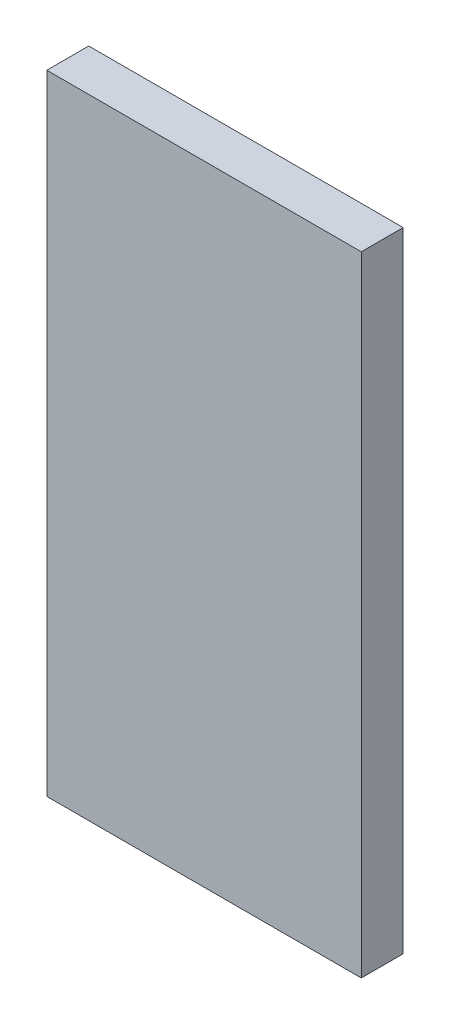
ISO-10303-21;
HEADER;
FILE_DESCRIPTION(('STEP AP214'),'2;1');
FILE_NAME('part.step','',(''),(''),'','','');
FILE_SCHEMA(('AUTOMOTIVE_DESIGN { 1 0 10303 214 1 1 1 1 }'));
ENDSEC;
DATA;
#1=APPLICATION_CONTEXT('core data for automotive mechanical design processes');
#2=APPLICATION_PROTOCOL_DEFINITION('international standard','automotive_design',2000,#1);
#3=PRODUCT_CONTEXT('',#1,'mechanical');
#4=PRODUCT('Part','Part','',(#3));
#5=PRODUCT_RELATED_PRODUCT_CATEGORY('part','',(#4));
#6=PRODUCT_DEFINITION_FORMATION('','',#4);
#7=PRODUCT_DEFINITION_CONTEXT('part definition',#1,'design');
#8=PRODUCT_DEFINITION('design','',#6,#7);
#9=PRODUCT_DEFINITION_SHAPE('','',#8);
#10=(LENGTH_UNIT() NAMED_UNIT(*) SI_UNIT(.MILLI.,.METRE.));
#11=(NAMED_UNIT(*) PLANE_ANGLE_UNIT() SI_UNIT($,.RADIAN.));
#12=(NAMED_UNIT(*) SI_UNIT($,.STERADIAN.) SOLID_ANGLE_UNIT());
#13=UNCERTAINTY_MEASURE_WITH_UNIT(LENGTH_MEASURE(1.E-05),#10,'distance_accuracy_value','');
#14=(GEOMETRIC_REPRESENTATION_CONTEXT(3) GLOBAL_UNCERTAINTY_ASSIGNED_CONTEXT((#13)) GLOBAL_UNIT_ASSIGNED_CONTEXT((#10,
#11,#12)) REPRESENTATION_CONTEXT('',''));
#15=CARTESIAN_POINT('',(0.,0.,0.));
#16=DIRECTION('',(0.,0.,1.));
#17=DIRECTION('',(1.,0.,0.));
#18=AXIS2_PLACEMENT_3D('',#15,#16,#17);
#19=CARTESIAN_POINT('',(-7.5,-15.,2.));
#20=DIRECTION('',(1.,0.,0.));
#21=DIRECTION('',(0.,1.,0.));
#22=AXIS2_PLACEMENT_3D('',#19,#20,#21);
#23=PLANE('',#22);
#24=DIRECTION('',(0.,-1.,0.));
#25=VECTOR('',#24,1.);
#26=CARTESIAN_POINT('',(-7.5,-15.,0.));
#27=LINE('',#26,#25);
#28=CARTESIAN_POINT('',(-7.5,15.,0.));
#29=VERTEX_POINT('',#28);
#30=CARTESIAN_POINT('',(-7.5,-15.,0.));
#31=VERTEX_POINT('',#30);
#32=EDGE_CURVE('E96',#29,#31,#27,.T.);
#33=ORIENTED_EDGE('',*,*,#32,.T.);
#34=DIRECTION('',(0.,0.,-1.));
#35=VECTOR('',#34,1.);
#36=CARTESIAN_POINT('',(-7.5,-15.,2.));
#37=LINE('',#36,#35);
#38=CARTESIAN_POINT('',(-7.5,-15.,2.));
#39=VERTEX_POINT('',#38);
#40=EDGE_CURVE('E11',#39,#31,#37,.T.);
#41=ORIENTED_EDGE('',*,*,#40,.F.);
#42=DIRECTION('',(0.,-1.,0.));
#43=VECTOR('',#42,1.);
#44=CARTESIAN_POINT('',(-7.5,-15.,2.));
#45=LINE('',#44,#43);
#46=CARTESIAN_POINT('',(-7.5,15.,2.));
#47=VERTEX_POINT('',#46);
#48=EDGE_CURVE('E84',#47,#39,#45,.T.);
#49=ORIENTED_EDGE('',*,*,#48,.F.);
#50=DIRECTION('',(0.,0.,-1.));
#51=VECTOR('',#50,1.);
#52=CARTESIAN_POINT('',(-7.5,15.,2.));
#53=LINE('',#52,#51);
#54=EDGE_CURVE('E92',#47,#29,#53,.T.);
#55=ORIENTED_EDGE('',*,*,#54,.T.);
#56=EDGE_LOOP('',(#33,#41,#49,#55));
#57=FACE_BOUND('',#56,.T.);
#58=ADVANCED_FACE('F33',(#57),#23,.F.);
#59=CARTESIAN_POINT('',(7.5,-15.,2.));
#60=DIRECTION('',(0.,1.,0.));
#61=DIRECTION('',(-1.,0.,0.));
#62=AXIS2_PLACEMENT_3D('',#59,#60,#61);
#63=PLANE('',#62);
#64=DIRECTION('',(1.,0.,0.));
#65=VECTOR('',#64,1.);
#66=CARTESIAN_POINT('',(7.5,-15.,0.));
#67=LINE('',#66,#65);
#68=CARTESIAN_POINT('',(7.5,-15.,0.));
#69=VERTEX_POINT('',#68);
#70=EDGE_CURVE('E88',#31,#69,#67,.T.);
#71=ORIENTED_EDGE('',*,*,#70,.T.);
#72=DIRECTION('',(0.,0.,-1.));
#73=VECTOR('',#72,1.);
#74=CARTESIAN_POINT('',(7.5,-15.,2.));
#75=LINE('',#74,#73);
#76=CARTESIAN_POINT('',(7.5,-15.,2.));
#77=VERTEX_POINT('',#76);
#78=EDGE_CURVE('E41',#77,#69,#75,.T.);
#79=ORIENTED_EDGE('',*,*,#78,.F.);
#80=DIRECTION('',(1.,0.,0.));
#81=VECTOR('',#80,1.);
#82=CARTESIAN_POINT('',(7.5,-15.,2.));
#83=LINE('',#82,#81);
#84=EDGE_CURVE('E79',#39,#77,#83,.T.);
#85=ORIENTED_EDGE('',*,*,#84,.F.);
#86=ORIENTED_EDGE('',*,*,#40,.T.);
#87=EDGE_LOOP('',(#71,#79,#85,#86));
#88=FACE_BOUND('',#87,.T.);
#89=ADVANCED_FACE('F87',(#88),#63,.F.);
#90=CARTESIAN_POINT('',(7.5,-15.,2.));
#91=DIRECTION('',(-1.,0.,0.));
#92=DIRECTION('',(0.,0.,1.));
#93=AXIS2_PLACEMENT_3D('',#90,#91,#92);
#94=PLANE('',#93);
#95=DIRECTION('',(0.,1.,0.));
#96=VECTOR('',#95,1.);
#97=CARTESIAN_POINT('',(7.5,-15.,0.));
#98=LINE('',#97,#96);
#99=CARTESIAN_POINT('',(7.5,15.,0.));
#100=VERTEX_POINT('',#99);
#101=EDGE_CURVE('E66',#69,#100,#98,.T.);
#102=ORIENTED_EDGE('',*,*,#101,.T.);
#103=DIRECTION('',(0.,0.,-1.));
#104=VECTOR('',#103,1.);
#105=CARTESIAN_POINT('',(7.5,15.,2.));
#106=LINE('',#105,#104);
#107=CARTESIAN_POINT('',(7.5,15.,2.));
#108=VERTEX_POINT('',#107);
#109=EDGE_CURVE('E89',#108,#100,#106,.T.);
#110=ORIENTED_EDGE('',*,*,#109,.F.);
#111=DIRECTION('',(0.,1.,0.));
#112=VECTOR('',#111,1.);
#113=CARTESIAN_POINT('',(7.5,-15.,2.));
#114=LINE('',#113,#112);
#115=EDGE_CURVE('E82',#77,#108,#114,.T.);
#116=ORIENTED_EDGE('',*,*,#115,.F.);
#117=ORIENTED_EDGE('',*,*,#78,.T.);
#118=EDGE_LOOP('',(#102,#110,#116,#117));
#119=FACE_BOUND('',#118,.T.);
#120=ADVANCED_FACE('F90',(#119),#94,.F.);
#121=CARTESIAN_POINT('',(7.5,15.,2.));
#122=DIRECTION('',(0.,-1.,0.));
#123=DIRECTION('',(0.,0.,-1.));
#124=AXIS2_PLACEMENT_3D('',#121,#122,#123);
#125=PLANE('',#124);
#126=DIRECTION('',(-1.,0.,0.));
#127=VECTOR('',#126,1.);
#128=CARTESIAN_POINT('',(7.5,15.,0.));
#129=LINE('',#128,#127);
#130=EDGE_CURVE('E72',#100,#29,#129,.T.);
#131=ORIENTED_EDGE('',*,*,#130,.T.);
#132=ORIENTED_EDGE('',*,*,#54,.F.);
#133=DIRECTION('',(-1.,0.,0.));
#134=VECTOR('',#133,1.);
#135=CARTESIAN_POINT('',(7.5,15.,2.));
#136=LINE('',#135,#134);
#137=EDGE_CURVE('E49',#108,#47,#136,.T.);
#138=ORIENTED_EDGE('',*,*,#137,.F.);
#139=ORIENTED_EDGE('',*,*,#109,.T.);
#140=EDGE_LOOP('',(#131,#132,#138,#139));
#141=FACE_BOUND('',#140,.T.);
#142=ADVANCED_FACE('F103',(#141),#125,.F.);
#143=CARTESIAN_POINT('',(0.,0.,2.));
#144=DIRECTION('',(0.,0.,1.));
#145=DIRECTION('',(1.,0.,0.));
#146=AXIS2_PLACEMENT_3D('',#143,#144,#145);
#147=PLANE('',#146);
#148=ORIENTED_EDGE('',*,*,#48,.T.);
#149=ORIENTED_EDGE('',*,*,#84,.T.);
#150=ORIENTED_EDGE('',*,*,#115,.T.);
#151=ORIENTED_EDGE('',*,*,#137,.T.);
#152=EDGE_LOOP('',(#148,#149,#150,#151));
#153=FACE_BOUND('',#152,.T.);
#154=ADVANCED_FACE('F80',(#153),#147,.T.);
#155=CARTESIAN_POINT('',(0.,0.,0.));
#156=DIRECTION('',(0.,0.,1.));
#157=DIRECTION('',(1.,0.,0.));
#158=AXIS2_PLACEMENT_3D('',#155,#156,#157);
#159=PLANE('',#158);
#160=ORIENTED_EDGE('',*,*,#32,.F.);
#161=ORIENTED_EDGE('',*,*,#130,.F.);
#162=ORIENTED_EDGE('',*,*,#101,.F.);
#163=ORIENTED_EDGE('',*,*,#70,.F.);
#164=EDGE_LOOP('',(#160,#161,#162,#163));
#165=FACE_BOUND('',#164,.T.);
#166=ADVANCED_FACE('F106',(#165),#159,.F.);
#167=CLOSED_SHELL('',(#58,#89,#120,#142,#154,#166));
#168=MANIFOLD_SOLID_BREP('B2',#167);
#169=ADVANCED_BREP_SHAPE_REPRESENTATION('',(#18,#168),#14);
#170=SHAPE_DEFINITION_REPRESENTATION(#9,#169);
ENDSEC;
END-ISO-10303-21;
